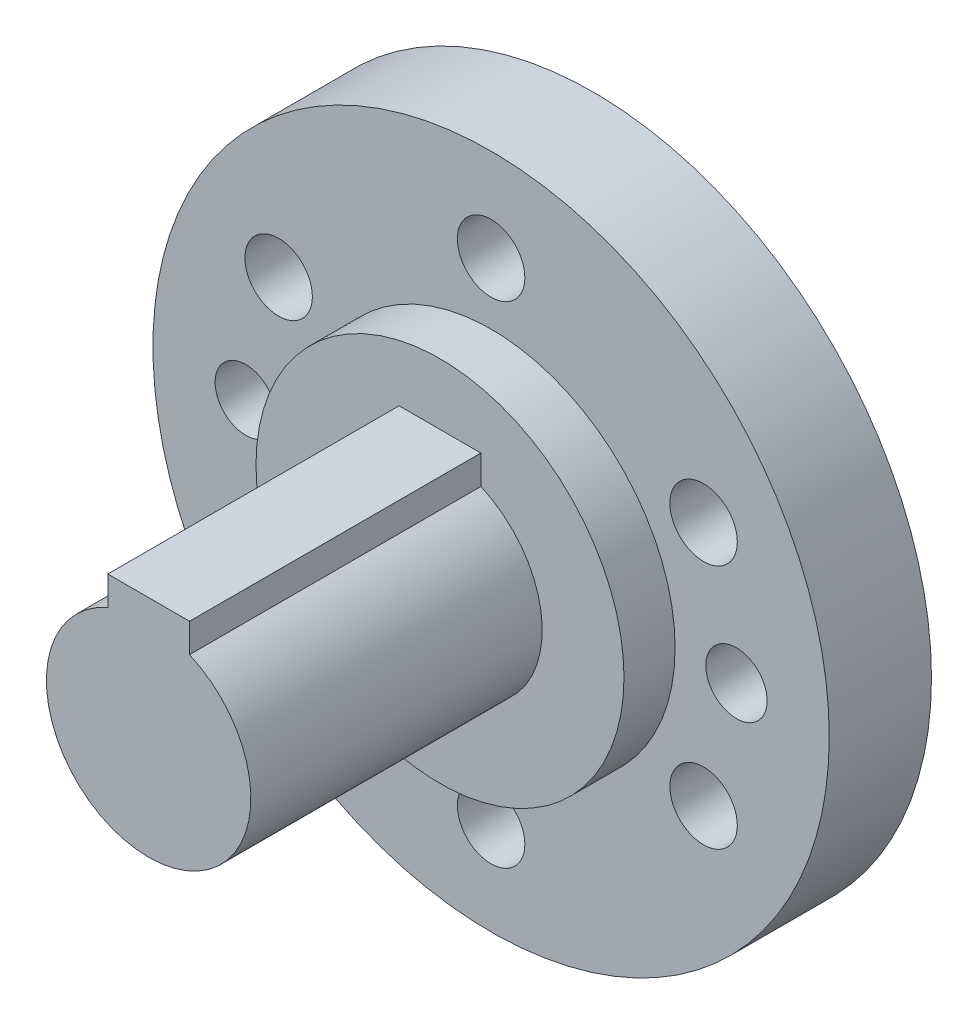
ISO-10303-21;
HEADER;
FILE_DESCRIPTION(('STEP AP214'),'2;1');
FILE_NAME('part.step','',(''),(''),'','','');
FILE_SCHEMA(('AUTOMOTIVE_DESIGN { 1 0 10303 214 1 1 1 1 }'));
ENDSEC;
DATA;
#1=APPLICATION_CONTEXT('core data for automotive mechanical design processes');
#2=APPLICATION_PROTOCOL_DEFINITION('international standard','automotive_design',2000,#1);
#3=PRODUCT_CONTEXT('',#1,'mechanical');
#4=PRODUCT('Part','Part','',(#3));
#5=PRODUCT_RELATED_PRODUCT_CATEGORY('part','',(#4));
#6=PRODUCT_DEFINITION_FORMATION('','',#4);
#7=PRODUCT_DEFINITION_CONTEXT('part definition',#1,'design');
#8=PRODUCT_DEFINITION('design','',#6,#7);
#9=PRODUCT_DEFINITION_SHAPE('','',#8);
#10=(LENGTH_UNIT() NAMED_UNIT(*) SI_UNIT(.MILLI.,.METRE.));
#11=(NAMED_UNIT(*) PLANE_ANGLE_UNIT() SI_UNIT($,.RADIAN.));
#12=(NAMED_UNIT(*) SI_UNIT($,.STERADIAN.) SOLID_ANGLE_UNIT());
#13=UNCERTAINTY_MEASURE_WITH_UNIT(LENGTH_MEASURE(1.E-05),#10,'distance_accuracy_value','');
#14=(GEOMETRIC_REPRESENTATION_CONTEXT(3) GLOBAL_UNCERTAINTY_ASSIGNED_CONTEXT((#13)) GLOBAL_UNIT_ASSIGNED_CONTEXT((#10,
#11,#12)) REPRESENTATION_CONTEXT('',''));
#15=CARTESIAN_POINT('',(0.,0.,0.));
#16=DIRECTION('',(0.,0.,1.));
#17=DIRECTION('',(1.,0.,0.));
#18=AXIS2_PLACEMENT_3D('',#15,#16,#17);
#19=CARTESIAN_POINT('',(0.,0.,2.5));
#20=DIRECTION('',(0.,0.,-1.));
#21=DIRECTION('',(-1.,0.,0.));
#22=AXIS2_PLACEMENT_3D('',#19,#20,#21);
#23=CYLINDRICAL_SURFACE('',#22,9.);
#24=CARTESIAN_POINT('',(0.,0.,-2.5));
#25=DIRECTION('',(0.,0.,1.));
#26=DIRECTION('',(1.,0.,0.));
#27=AXIS2_PLACEMENT_3D('',#24,#25,#26);
#28=CIRCLE('',#27,9.);
#29=CARTESIAN_POINT('',(9.,0.,-2.5));
#30=VERTEX_POINT('',#29);
#31=EDGE_CURVE('E157',#30,#30,#28,.T.);
#32=ORIENTED_EDGE('',*,*,#31,.F.);
#33=EDGE_LOOP('',(#32));
#34=FACE_BOUND('',#33,.T.);
#35=CARTESIAN_POINT('',(0.,0.,0.));
#36=DIRECTION('',(0.,0.,1.));
#37=DIRECTION('',(1.,0.,0.));
#38=AXIS2_PLACEMENT_3D('',#35,#36,#37);
#39=CIRCLE('',#38,9.);
#40=CARTESIAN_POINT('',(9.,0.,0.));
#41=VERTEX_POINT('',#40);
#42=EDGE_CURVE('E100',#41,#41,#39,.T.);
#43=ORIENTED_EDGE('',*,*,#42,.T.);
#44=EDGE_LOOP('',(#43));
#45=FACE_BOUND('',#44,.T.);
#46=ADVANCED_FACE('F39',(#34,#45),#23,.F.);
#47=CARTESIAN_POINT('',(0.,0.,2.5));
#48=DIRECTION('',(0.,0.,1.));
#49=DIRECTION('',(1.,0.,0.));
#50=AXIS2_PLACEMENT_3D('',#47,#48,#49);
#51=PLANE('',#50);
#52=CARTESIAN_POINT('',(12.,0.,2.5));
#53=DIRECTION('',(0.,0.,1.));
#54=DIRECTION('',(1.,0.,0.));
#55=AXIS2_PLACEMENT_3D('',#52,#53,#54);
#56=CIRCLE('',#55,1.5);
#57=CARTESIAN_POINT('',(13.5,0.,2.5));
#58=VERTEX_POINT('',#57);
#59=EDGE_CURVE('E118',#58,#58,#56,.T.);
#60=ORIENTED_EDGE('',*,*,#59,.F.);
#61=EDGE_LOOP('',(#60));
#62=FACE_BOUND('',#61,.T.);
#63=CARTESIAN_POINT('',(-10.3923048454133,-5.9999999999999,2.5));
#64=DIRECTION('',(0.,0.,1.));
#65=DIRECTION('',(1.,0.,0.));
#66=AXIS2_PLACEMENT_3D('',#63,#64,#65);
#67=CIRCLE('',#66,1.64999999999999);
#68=CARTESIAN_POINT('',(-8.74230484541333,-5.9999999999999,2.5));
#69=VERTEX_POINT('',#68);
#70=EDGE_CURVE('E130',#69,#69,#67,.T.);
#71=ORIENTED_EDGE('',*,*,#70,.F.);
#72=EDGE_LOOP('',(#71));
#73=FACE_BOUND('',#72,.T.);
#74=CARTESIAN_POINT('',(10.3923048454132,-6.,2.5));
#75=DIRECTION('',(0.,0.,1.));
#76=DIRECTION('',(1.,0.,0.));
#77=AXIS2_PLACEMENT_3D('',#74,#75,#76);
#78=CIRCLE('',#77,1.64999999999999);
#79=CARTESIAN_POINT('',(12.0423048454132,-6.,2.5));
#80=VERTEX_POINT('',#79);
#81=EDGE_CURVE('E142',#80,#80,#78,.T.);
#82=ORIENTED_EDGE('',*,*,#81,.F.);
#83=EDGE_LOOP('',(#82));
#84=FACE_BOUND('',#83,.T.);
#85=CARTESIAN_POINT('',(0.,12.,2.5));
#86=DIRECTION('',(0.,0.,1.));
#87=DIRECTION('',(1.,0.,0.));
#88=AXIS2_PLACEMENT_3D('',#85,#86,#87);
#89=CIRCLE('',#88,1.65);
#90=CARTESIAN_POINT('',(1.65,12.,2.5));
#91=VERTEX_POINT('',#90);
#92=EDGE_CURVE('E154',#91,#91,#89,.T.);
#93=ORIENTED_EDGE('',*,*,#92,.F.);
#94=EDGE_LOOP('',(#93));
#95=FACE_BOUND('',#94,.T.);
#96=CARTESIAN_POINT('',(0.,0.,2.5));
#97=DIRECTION('',(0.,0.,1.));
#98=DIRECTION('',(1.,0.,0.));
#99=AXIS2_PLACEMENT_3D('',#96,#97,#98);
#100=CIRCLE('',#99,16.5398274025295);
#101=CARTESIAN_POINT('',(16.5398274025295,0.,2.5));
#102=VERTEX_POINT('',#101);
#103=EDGE_CURVE('E11',#102,#102,#100,.T.);
#104=ORIENTED_EDGE('',*,*,#103,.T.);
#105=EDGE_LOOP('',(#104));
#106=FACE_BOUND('',#105,.T.);
#107=CARTESIAN_POINT('',(0.,0.,2.5));
#108=DIRECTION('',(0.,0.,1.));
#109=DIRECTION('',(1.,0.,0.));
#110=AXIS2_PLACEMENT_3D('',#107,#108,#109);
#111=CIRCLE('',#110,9.);
#112=CARTESIAN_POINT('',(9.,0.,2.5));
#113=VERTEX_POINT('',#112);
#114=EDGE_CURVE('E160',#113,#113,#111,.T.);
#115=ORIENTED_EDGE('',*,*,#114,.F.);
#116=EDGE_LOOP('',(#115));
#117=FACE_BOUND('',#116,.T.);
#118=CARTESIAN_POINT('',(10.3923048454133,6.,2.5));
#119=DIRECTION('',(0.,0.,1.));
#120=DIRECTION('',(1.,0.,0.));
#121=AXIS2_PLACEMENT_3D('',#118,#119,#120);
#122=CIRCLE('',#121,1.64999999999999);
#123=CARTESIAN_POINT('',(12.0423048454133,6.,2.5));
#124=VERTEX_POINT('',#123);
#125=EDGE_CURVE('E148',#124,#124,#122,.T.);
#126=ORIENTED_EDGE('',*,*,#125,.F.);
#127=EDGE_LOOP('',(#126));
#128=FACE_BOUND('',#127,.T.);
#129=CARTESIAN_POINT('',(0.,-12.,2.5));
#130=DIRECTION('',(0.,0.,1.));
#131=DIRECTION('',(1.,0.,0.));
#132=AXIS2_PLACEMENT_3D('',#129,#130,#131);
#133=CIRCLE('',#132,1.65);
#134=CARTESIAN_POINT('',(1.65,-12.,2.5));
#135=VERTEX_POINT('',#134);
#136=EDGE_CURVE('E136',#135,#135,#133,.T.);
#137=ORIENTED_EDGE('',*,*,#136,.F.);
#138=EDGE_LOOP('',(#137));
#139=FACE_BOUND('',#138,.T.);
#140=CARTESIAN_POINT('',(-10.3923048454132,6.00000000000012,2.5));
#141=DIRECTION('',(0.,0.,1.));
#142=DIRECTION('',(1.,0.,0.));
#143=AXIS2_PLACEMENT_3D('',#140,#141,#142);
#144=CIRCLE('',#143,1.64999999999999);
#145=CARTESIAN_POINT('',(-8.74230484541321,6.00000000000012,2.5));
#146=VERTEX_POINT('',#145);
#147=EDGE_CURVE('E124',#146,#146,#144,.T.);
#148=ORIENTED_EDGE('',*,*,#147,.F.);
#149=EDGE_LOOP('',(#148));
#150=FACE_BOUND('',#149,.T.);
#151=CARTESIAN_POINT('',(-12.,0.,2.5));
#152=DIRECTION('',(0.,0.,1.));
#153=DIRECTION('',(1.,0.,0.));
#154=AXIS2_PLACEMENT_3D('',#151,#152,#153);
#155=CIRCLE('',#154,1.5);
#156=CARTESIAN_POINT('',(-10.5,0.,2.5));
#157=VERTEX_POINT('',#156);
#158=EDGE_CURVE('E112',#157,#157,#155,.T.);
#159=ORIENTED_EDGE('',*,*,#158,.F.);
#160=EDGE_LOOP('',(#159));
#161=FACE_BOUND('',#160,.T.);
#162=ADVANCED_FACE('F171',(#62,#73,#84,#95,#106,#117,#128,#139,#150,#161),#51,.T.);
#163=CARTESIAN_POINT('',(0.,0.,-2.5));
#164=DIRECTION('',(0.,0.,1.));
#165=DIRECTION('',(1.,0.,0.));
#166=AXIS2_PLACEMENT_3D('',#163,#164,#165);
#167=PLANE('',#166);
#168=CARTESIAN_POINT('',(0.,0.,-2.5));
#169=DIRECTION('',(0.,0.,1.));
#170=DIRECTION('',(1.,0.,0.));
#171=AXIS2_PLACEMENT_3D('',#168,#169,#170);
#172=CIRCLE('',#171,16.5398274025295);
#173=CARTESIAN_POINT('',(16.5398274025295,0.,-2.5));
#174=VERTEX_POINT('',#173);
#175=EDGE_CURVE('E43',#174,#174,#172,.T.);
#176=ORIENTED_EDGE('',*,*,#175,.F.);
#177=EDGE_LOOP('',(#176));
#178=FACE_BOUND('',#177,.T.);
#179=ORIENTED_EDGE('',*,*,#31,.T.);
#180=EDGE_LOOP('',(#179));
#181=FACE_BOUND('',#180,.T.);
#182=CARTESIAN_POINT('',(0.,12.,-2.5));
#183=DIRECTION('',(0.,0.,1.));
#184=DIRECTION('',(1.,0.,0.));
#185=AXIS2_PLACEMENT_3D('',#182,#183,#184);
#186=CIRCLE('',#185,1.65);
#187=CARTESIAN_POINT('',(1.65,12.,-2.5));
#188=VERTEX_POINT('',#187);
#189=EDGE_CURVE('E151',#188,#188,#186,.T.);
#190=ORIENTED_EDGE('',*,*,#189,.T.);
#191=EDGE_LOOP('',(#190));
#192=FACE_BOUND('',#191,.T.);
#193=CARTESIAN_POINT('',(10.3923048454133,6.,-2.5));
#194=DIRECTION('',(0.,0.,1.));
#195=DIRECTION('',(1.,0.,0.));
#196=AXIS2_PLACEMENT_3D('',#193,#194,#195);
#197=CIRCLE('',#196,1.64999999999999);
#198=CARTESIAN_POINT('',(12.0423048454133,6.,-2.5));
#199=VERTEX_POINT('',#198);
#200=EDGE_CURVE('E145',#199,#199,#197,.T.);
#201=ORIENTED_EDGE('',*,*,#200,.T.);
#202=EDGE_LOOP('',(#201));
#203=FACE_BOUND('',#202,.T.);
#204=CARTESIAN_POINT('',(10.3923048454132,-6.,-2.5));
#205=DIRECTION('',(0.,0.,1.));
#206=DIRECTION('',(1.,0.,0.));
#207=AXIS2_PLACEMENT_3D('',#204,#205,#206);
#208=CIRCLE('',#207,1.64999999999999);
#209=CARTESIAN_POINT('',(12.0423048454132,-6.,-2.5));
#210=VERTEX_POINT('',#209);
#211=EDGE_CURVE('E139',#210,#210,#208,.T.);
#212=ORIENTED_EDGE('',*,*,#211,.T.);
#213=EDGE_LOOP('',(#212));
#214=FACE_BOUND('',#213,.T.);
#215=CARTESIAN_POINT('',(0.,-12.,-2.5));
#216=DIRECTION('',(0.,0.,1.));
#217=DIRECTION('',(1.,0.,0.));
#218=AXIS2_PLACEMENT_3D('',#215,#216,#217);
#219=CIRCLE('',#218,1.65);
#220=CARTESIAN_POINT('',(1.65,-12.,-2.5));
#221=VERTEX_POINT('',#220);
#222=EDGE_CURVE('E133',#221,#221,#219,.T.);
#223=ORIENTED_EDGE('',*,*,#222,.T.);
#224=EDGE_LOOP('',(#223));
#225=FACE_BOUND('',#224,.T.);
#226=CARTESIAN_POINT('',(-10.3923048454133,-5.9999999999999,-2.5));
#227=DIRECTION('',(0.,0.,1.));
#228=DIRECTION('',(1.,0.,0.));
#229=AXIS2_PLACEMENT_3D('',#226,#227,#228);
#230=CIRCLE('',#229,1.64999999999999);
#231=CARTESIAN_POINT('',(-8.74230484541333,-5.9999999999999,-2.5));
#232=VERTEX_POINT('',#231);
#233=EDGE_CURVE('E127',#232,#232,#230,.T.);
#234=ORIENTED_EDGE('',*,*,#233,.T.);
#235=EDGE_LOOP('',(#234));
#236=FACE_BOUND('',#235,.T.);
#237=CARTESIAN_POINT('',(-10.3923048454132,6.00000000000012,-2.5));
#238=DIRECTION('',(0.,0.,1.));
#239=DIRECTION('',(1.,0.,0.));
#240=AXIS2_PLACEMENT_3D('',#237,#238,#239);
#241=CIRCLE('',#240,1.64999999999999);
#242=CARTESIAN_POINT('',(-8.74230484541321,6.00000000000012,-2.5));
#243=VERTEX_POINT('',#242);
#244=EDGE_CURVE('E121',#243,#243,#241,.T.);
#245=ORIENTED_EDGE('',*,*,#244,.T.);
#246=EDGE_LOOP('',(#245));
#247=FACE_BOUND('',#246,.T.);
#248=CARTESIAN_POINT('',(12.,0.,-2.5));
#249=DIRECTION('',(0.,0.,1.));
#250=DIRECTION('',(1.,0.,0.));
#251=AXIS2_PLACEMENT_3D('',#248,#249,#250);
#252=CIRCLE('',#251,1.5);
#253=CARTESIAN_POINT('',(13.5,0.,-2.5));
#254=VERTEX_POINT('',#253);
#255=EDGE_CURVE('E115',#254,#254,#252,.T.);
#256=ORIENTED_EDGE('',*,*,#255,.T.);
#257=EDGE_LOOP('',(#256));
#258=FACE_BOUND('',#257,.T.);
#259=CARTESIAN_POINT('',(-12.,0.,-2.5));
#260=DIRECTION('',(0.,0.,1.));
#261=DIRECTION('',(1.,0.,0.));
#262=AXIS2_PLACEMENT_3D('',#259,#260,#261);
#263=CIRCLE('',#262,1.5);
#264=CARTESIAN_POINT('',(-10.5,0.,-2.5));
#265=VERTEX_POINT('',#264);
#266=EDGE_CURVE('E110',#265,#265,#263,.T.);
#267=ORIENTED_EDGE('',*,*,#266,.T.);
#268=EDGE_LOOP('',(#267));
#269=FACE_BOUND('',#268,.T.);
#270=ADVANCED_FACE('F166',(#178,#181,#192,#203,#214,#225,#236,#247,#258,#269),#167,.F.);
#271=CARTESIAN_POINT('',(0.,0.,2.5));
#272=DIRECTION('',(0.,0.,-1.));
#273=DIRECTION('',(-1.,0.,0.));
#274=AXIS2_PLACEMENT_3D('',#271,#272,#273);
#275=CYLINDRICAL_SURFACE('',#274,16.5398274025295);
#276=ORIENTED_EDGE('',*,*,#103,.F.);
#277=EDGE_LOOP('',(#276));
#278=FACE_BOUND('',#277,.T.);
#279=ORIENTED_EDGE('',*,*,#175,.T.);
#280=EDGE_LOOP('',(#279));
#281=FACE_BOUND('',#280,.T.);
#282=ADVANCED_FACE('F41',(#278,#281),#275,.T.);
#283=CARTESIAN_POINT('',(0.,12.,2.5));
#284=DIRECTION('',(0.,0.,-1.));
#285=DIRECTION('',(-1.,0.,0.));
#286=AXIS2_PLACEMENT_3D('',#283,#284,#285);
#287=CYLINDRICAL_SURFACE('',#286,1.65);
#288=ORIENTED_EDGE('',*,*,#189,.F.);
#289=EDGE_LOOP('',(#288));
#290=FACE_BOUND('',#289,.T.);
#291=ORIENTED_EDGE('',*,*,#92,.T.);
#292=EDGE_LOOP('',(#291));
#293=FACE_BOUND('',#292,.T.);
#294=ADVANCED_FACE('F215',(#290,#293),#287,.F.);
#295=CARTESIAN_POINT('',(10.3923048454133,6.,2.5));
#296=DIRECTION('',(0.,0.,-1.));
#297=DIRECTION('',(-1.,0.,0.));
#298=AXIS2_PLACEMENT_3D('',#295,#296,#297);
#299=CYLINDRICAL_SURFACE('',#298,1.64999999999999);
#300=ORIENTED_EDGE('',*,*,#200,.F.);
#301=EDGE_LOOP('',(#300));
#302=FACE_BOUND('',#301,.T.);
#303=ORIENTED_EDGE('',*,*,#125,.T.);
#304=EDGE_LOOP('',(#303));
#305=FACE_BOUND('',#304,.T.);
#306=ADVANCED_FACE('F211',(#302,#305),#299,.F.);
#307=CARTESIAN_POINT('',(10.3923048454132,-6.,2.5));
#308=DIRECTION('',(0.,0.,-1.));
#309=DIRECTION('',(-1.,0.,0.));
#310=AXIS2_PLACEMENT_3D('',#307,#308,#309);
#311=CYLINDRICAL_SURFACE('',#310,1.64999999999999);
#312=ORIENTED_EDGE('',*,*,#211,.F.);
#313=EDGE_LOOP('',(#312));
#314=FACE_BOUND('',#313,.T.);
#315=ORIENTED_EDGE('',*,*,#81,.T.);
#316=EDGE_LOOP('',(#315));
#317=FACE_BOUND('',#316,.T.);
#318=ADVANCED_FACE('F207',(#314,#317),#311,.F.);
#319=CARTESIAN_POINT('',(0.,-12.,2.5));
#320=DIRECTION('',(0.,0.,-1.));
#321=DIRECTION('',(-1.,0.,0.));
#322=AXIS2_PLACEMENT_3D('',#319,#320,#321);
#323=CYLINDRICAL_SURFACE('',#322,1.65);
#324=ORIENTED_EDGE('',*,*,#222,.F.);
#325=EDGE_LOOP('',(#324));
#326=FACE_BOUND('',#325,.T.);
#327=ORIENTED_EDGE('',*,*,#136,.T.);
#328=EDGE_LOOP('',(#327));
#329=FACE_BOUND('',#328,.T.);
#330=ADVANCED_FACE('F203',(#326,#329),#323,.F.);
#331=CARTESIAN_POINT('',(-10.3923048454133,-5.9999999999999,2.5));
#332=DIRECTION('',(0.,0.,-1.));
#333=DIRECTION('',(-1.,0.,0.));
#334=AXIS2_PLACEMENT_3D('',#331,#332,#333);
#335=CYLINDRICAL_SURFACE('',#334,1.64999999999999);
#336=ORIENTED_EDGE('',*,*,#233,.F.);
#337=EDGE_LOOP('',(#336));
#338=FACE_BOUND('',#337,.T.);
#339=ORIENTED_EDGE('',*,*,#70,.T.);
#340=EDGE_LOOP('',(#339));
#341=FACE_BOUND('',#340,.T.);
#342=ADVANCED_FACE('F199',(#338,#341),#335,.F.);
#343=CARTESIAN_POINT('',(-10.3923048454132,6.00000000000012,2.5));
#344=DIRECTION('',(0.,0.,-1.));
#345=DIRECTION('',(-1.,0.,0.));
#346=AXIS2_PLACEMENT_3D('',#343,#344,#345);
#347=CYLINDRICAL_SURFACE('',#346,1.64999999999999);
#348=ORIENTED_EDGE('',*,*,#244,.F.);
#349=EDGE_LOOP('',(#348));
#350=FACE_BOUND('',#349,.T.);
#351=ORIENTED_EDGE('',*,*,#147,.T.);
#352=EDGE_LOOP('',(#351));
#353=FACE_BOUND('',#352,.T.);
#354=ADVANCED_FACE('F195',(#350,#353),#347,.F.);
#355=CARTESIAN_POINT('',(12.,0.,2.5));
#356=DIRECTION('',(0.,0.,-1.));
#357=DIRECTION('',(-1.,0.,0.));
#358=AXIS2_PLACEMENT_3D('',#355,#356,#357);
#359=CYLINDRICAL_SURFACE('',#358,1.5);
#360=ORIENTED_EDGE('',*,*,#255,.F.);
#361=EDGE_LOOP('',(#360));
#362=FACE_BOUND('',#361,.T.);
#363=ORIENTED_EDGE('',*,*,#59,.T.);
#364=EDGE_LOOP('',(#363));
#365=FACE_BOUND('',#364,.T.);
#366=ADVANCED_FACE('F187',(#362,#365),#359,.F.);
#367=CARTESIAN_POINT('',(-12.,0.,2.5));
#368=DIRECTION('',(0.,0.,-1.));
#369=DIRECTION('',(-1.,0.,0.));
#370=AXIS2_PLACEMENT_3D('',#367,#368,#369);
#371=CYLINDRICAL_SURFACE('',#370,1.5);
#372=ORIENTED_EDGE('',*,*,#266,.F.);
#373=EDGE_LOOP('',(#372));
#374=FACE_BOUND('',#373,.T.);
#375=ORIENTED_EDGE('',*,*,#158,.T.);
#376=EDGE_LOOP('',(#375));
#377=FACE_BOUND('',#376,.T.);
#378=ADVANCED_FACE('F178',(#374,#377),#371,.F.);
#379=CARTESIAN_POINT('',(0.,0.,0.));
#380=DIRECTION('',(0.,0.,1.));
#381=DIRECTION('',(1.,0.,0.));
#382=AXIS2_PLACEMENT_3D('',#379,#380,#381);
#383=PLANE('',#382);
#384=ORIENTED_EDGE('',*,*,#42,.F.);
#385=EDGE_LOOP('',(#384));
#386=FACE_BOUND('',#385,.T.);
#387=ADVANCED_FACE('F175',(#386),#383,.F.);
#388=CARTESIAN_POINT('',(0.,0.,5.));
#389=DIRECTION('',(0.,0.,-1.));
#390=DIRECTION('',(-1.,0.,0.));
#391=AXIS2_PLACEMENT_3D('',#388,#389,#390);
#392=CYLINDRICAL_SURFACE('',#391,9.);
#393=ORIENTED_EDGE('',*,*,#114,.T.);
#394=EDGE_LOOP('',(#393));
#395=FACE_BOUND('',#394,.T.);
#396=CARTESIAN_POINT('',(0.,0.,5.));
#397=DIRECTION('',(0.,0.,1.));
#398=DIRECTION('',(1.,0.,0.));
#399=AXIS2_PLACEMENT_3D('',#396,#397,#398);
#400=CIRCLE('',#399,9.);
#401=CARTESIAN_POINT('',(9.,0.,5.));
#402=VERTEX_POINT('',#401);
#403=EDGE_CURVE('E103',#402,#402,#400,.T.);
#404=ORIENTED_EDGE('',*,*,#403,.F.);
#405=EDGE_LOOP('',(#404));
#406=FACE_BOUND('',#405,.T.);
#407=ADVANCED_FACE('F177',(#395,#406),#392,.T.);
#408=CARTESIAN_POINT('',(0.,0.,5.));
#409=DIRECTION('',(0.,0.,1.));
#410=DIRECTION('',(1.,0.,0.));
#411=AXIS2_PLACEMENT_3D('',#408,#409,#410);
#412=PLANE('',#411);
#413=DIRECTION('',(0.,1.,0.));
#414=VECTOR('',#413,1.);
#415=CARTESIAN_POINT('',(2.,4.58257569495584,5.));
#416=LINE('',#415,#414);
#417=CARTESIAN_POINT('',(2.,4.58257569495584,5.));
#418=VERTEX_POINT('',#417);
#419=CARTESIAN_POINT('',(2.,6.,5.));
#420=VERTEX_POINT('',#419);
#421=EDGE_CURVE('E54',#418,#420,#416,.T.);
#422=ORIENTED_EDGE('',*,*,#421,.F.);
#423=CARTESIAN_POINT('',(0.,0.,5.));
#424=DIRECTION('',(0.,0.,1.));
#425=DIRECTION('',(1.,0.,0.));
#426=AXIS2_PLACEMENT_3D('',#423,#424,#425);
#427=CIRCLE('',#426,5.);
#428=CARTESIAN_POINT('',(-2.,4.58257569495584,5.));
#429=VERTEX_POINT('',#428);
#430=EDGE_CURVE('E58',#429,#418,#427,.T.);
#431=ORIENTED_EDGE('',*,*,#430,.F.);
#432=DIRECTION('',(0.,-1.,0.));
#433=VECTOR('',#432,1.);
#434=CARTESIAN_POINT('',(-2.,4.58257569495584,5.));
#435=LINE('',#434,#433);
#436=CARTESIAN_POINT('',(-2.,6.,5.));
#437=VERTEX_POINT('',#436);
#438=EDGE_CURVE('E410',#437,#429,#435,.T.);
#439=ORIENTED_EDGE('',*,*,#438,.F.);
#440=DIRECTION('',(-1.,0.,0.));
#441=VECTOR('',#440,1.);
#442=CARTESIAN_POINT('',(-2.,6.,5.));
#443=LINE('',#442,#441);
#444=EDGE_CURVE('E416',#420,#437,#443,.T.);
#445=ORIENTED_EDGE('',*,*,#444,.F.);
#446=EDGE_LOOP('',(#422,#431,#439,#445));
#447=FACE_BOUND('',#446,.T.);
#448=ORIENTED_EDGE('',*,*,#403,.T.);
#449=EDGE_LOOP('',(#448));
#450=FACE_BOUND('',#449,.T.);
#451=ADVANCED_FACE('F183',(#447,#450),#412,.T.);
#452=CARTESIAN_POINT('',(2.,4.58257569495584,19.25));
#453=DIRECTION('',(-1.,0.,0.));
#454=DIRECTION('',(0.,0.,1.));
#455=AXIS2_PLACEMENT_3D('',#452,#453,#454);
#456=PLANE('',#455);
#457=ORIENTED_EDGE('',*,*,#421,.T.);
#458=DIRECTION('',(0.,0.,-1.));
#459=VECTOR('',#458,1.);
#460=CARTESIAN_POINT('',(2.,6.,19.25));
#461=LINE('',#460,#459);
#462=CARTESIAN_POINT('',(2.,6.,19.25));
#463=VERTEX_POINT('',#462);
#464=EDGE_CURVE('E83',#463,#420,#461,.T.);
#465=ORIENTED_EDGE('',*,*,#464,.F.);
#466=DIRECTION('',(0.,1.,0.));
#467=VECTOR('',#466,1.);
#468=CARTESIAN_POINT('',(2.,4.58257569495584,19.25));
#469=LINE('',#468,#467);
#470=CARTESIAN_POINT('',(2.,4.58257569495584,19.25));
#471=VERTEX_POINT('',#470);
#472=EDGE_CURVE('E89',#471,#463,#469,.T.);
#473=ORIENTED_EDGE('',*,*,#472,.F.);
#474=DIRECTION('',(0.,0.,-1.));
#475=VECTOR('',#474,1.);
#476=CARTESIAN_POINT('',(2.,4.58257569495584,19.25));
#477=LINE('',#476,#475);
#478=EDGE_CURVE('E408',#471,#418,#477,.T.);
#479=ORIENTED_EDGE('',*,*,#478,.T.);
#480=EDGE_LOOP('',(#457,#465,#473,#479));
#481=FACE_BOUND('',#480,.T.);
#482=ADVANCED_FACE('F99',(#481),#456,.F.);
#483=CARTESIAN_POINT('',(-2.,6.,19.25));
#484=DIRECTION('',(0.,-1.,0.));
#485=DIRECTION('',(0.,0.,-1.));
#486=AXIS2_PLACEMENT_3D('',#483,#484,#485);
#487=PLANE('',#486);
#488=ORIENTED_EDGE('',*,*,#444,.T.);
#489=DIRECTION('',(0.,0.,-1.));
#490=VECTOR('',#489,1.);
#491=CARTESIAN_POINT('',(-2.,6.,19.25));
#492=LINE('',#491,#490);
#493=CARTESIAN_POINT('',(-2.,6.,19.25));
#494=VERTEX_POINT('',#493);
#495=EDGE_CURVE('E85',#494,#437,#492,.T.);
#496=ORIENTED_EDGE('',*,*,#495,.F.);
#497=DIRECTION('',(-1.,0.,0.));
#498=VECTOR('',#497,1.);
#499=CARTESIAN_POINT('',(-2.,6.,19.25));
#500=LINE('',#499,#498);
#501=EDGE_CURVE('E78',#463,#494,#500,.T.);
#502=ORIENTED_EDGE('',*,*,#501,.F.);
#503=ORIENTED_EDGE('',*,*,#464,.T.);
#504=EDGE_LOOP('',(#488,#496,#502,#503));
#505=FACE_BOUND('',#504,.T.);
#506=ADVANCED_FACE('F81',(#505),#487,.F.);
#507=CARTESIAN_POINT('',(-2.,4.58257569495584,19.25));
#508=DIRECTION('',(1.,0.,0.));
#509=DIRECTION('',(0.,0.,-1.));
#510=AXIS2_PLACEMENT_3D('',#507,#508,#509);
#511=PLANE('',#510);
#512=ORIENTED_EDGE('',*,*,#438,.T.);
#513=DIRECTION('',(0.,0.,-1.));
#514=VECTOR('',#513,1.);
#515=CARTESIAN_POINT('',(-2.,4.58257569495584,19.25));
#516=LINE('',#515,#514);
#517=CARTESIAN_POINT('',(-2.,4.58257569495584,19.25));
#518=VERTEX_POINT('',#517);
#519=EDGE_CURVE('E105',#518,#429,#516,.T.);
#520=ORIENTED_EDGE('',*,*,#519,.F.);
#521=DIRECTION('',(0.,-1.,0.));
#522=VECTOR('',#521,1.);
#523=CARTESIAN_POINT('',(-2.,4.58257569495584,19.25));
#524=LINE('',#523,#522);
#525=EDGE_CURVE('E88',#494,#518,#524,.T.);
#526=ORIENTED_EDGE('',*,*,#525,.F.);
#527=ORIENTED_EDGE('',*,*,#495,.T.);
#528=EDGE_LOOP('',(#512,#520,#526,#527));
#529=FACE_BOUND('',#528,.T.);
#530=ADVANCED_FACE('F259',(#529),#511,.F.);
#531=CARTESIAN_POINT('',(0.,0.,19.25));
#532=DIRECTION('',(0.,0.,-1.));
#533=DIRECTION('',(-1.,0.,0.));
#534=AXIS2_PLACEMENT_3D('',#531,#532,#533);
#535=CYLINDRICAL_SURFACE('',#534,5.);
#536=ORIENTED_EDGE('',*,*,#430,.T.);
#537=ORIENTED_EDGE('',*,*,#478,.F.);
#538=CARTESIAN_POINT('',(0.,0.,19.25));
#539=DIRECTION('',(0.,0.,1.));
#540=DIRECTION('',(1.,0.,0.));
#541=AXIS2_PLACEMENT_3D('',#538,#539,#540);
#542=CIRCLE('',#541,5.);
#543=EDGE_CURVE('E94',#518,#471,#542,.T.);
#544=ORIENTED_EDGE('',*,*,#543,.F.);
#545=ORIENTED_EDGE('',*,*,#519,.T.);
#546=EDGE_LOOP('',(#536,#537,#544,#545));
#547=FACE_BOUND('',#546,.T.);
#548=ADVANCED_FACE('F264',(#547),#535,.T.);
#549=CARTESIAN_POINT('',(0.,0.,19.25));
#550=DIRECTION('',(0.,0.,1.));
#551=DIRECTION('',(1.,0.,0.));
#552=AXIS2_PLACEMENT_3D('',#549,#550,#551);
#553=PLANE('',#552);
#554=ORIENTED_EDGE('',*,*,#472,.T.);
#555=ORIENTED_EDGE('',*,*,#501,.T.);
#556=ORIENTED_EDGE('',*,*,#525,.T.);
#557=ORIENTED_EDGE('',*,*,#543,.T.);
#558=EDGE_LOOP('',(#554,#555,#556,#557));
#559=FACE_BOUND('',#558,.T.);
#560=ADVANCED_FACE('F92',(#559),#553,.T.);
#561=CLOSED_SHELL('',(#46,#162,#270,#282,#294,#306,#318,#330,#342,#354,#366,#378,#387,#407,#451,
#482,#506,#530,#548,#560));
#562=MANIFOLD_SOLID_BREP('B2',#561);
#563=ADVANCED_BREP_SHAPE_REPRESENTATION('',(#18,#562),#14);
#564=SHAPE_DEFINITION_REPRESENTATION(#9,#563);
ENDSEC;
END-ISO-10303-21;
